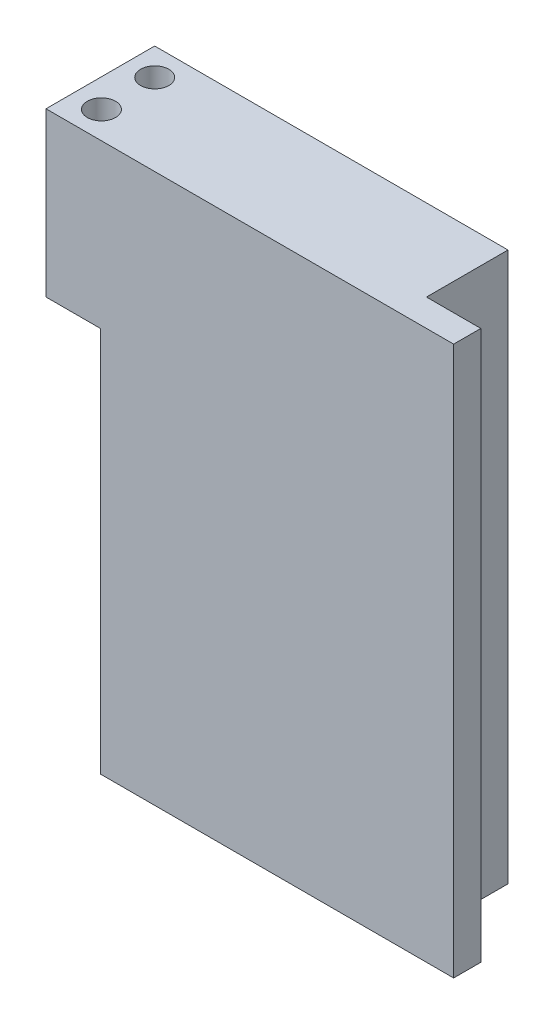
ISO-10303-21;
HEADER;
FILE_DESCRIPTION(('STEP AP214'),'2;1');
FILE_NAME('part.step','',(''),(''),'','','');
FILE_SCHEMA(('AUTOMOTIVE_DESIGN { 1 0 10303 214 1 1 1 1 }'));
ENDSEC;
DATA;
#1=APPLICATION_CONTEXT('core data for automotive mechanical design processes');
#2=APPLICATION_PROTOCOL_DEFINITION('international standard','automotive_design',2000,#1);
#3=PRODUCT_CONTEXT('',#1,'mechanical');
#4=PRODUCT('Part','Part','',(#3));
#5=PRODUCT_RELATED_PRODUCT_CATEGORY('part','',(#4));
#6=PRODUCT_DEFINITION_FORMATION('','',#4);
#7=PRODUCT_DEFINITION_CONTEXT('part definition',#1,'design');
#8=PRODUCT_DEFINITION('design','',#6,#7);
#9=PRODUCT_DEFINITION_SHAPE('','',#8);
#10=(LENGTH_UNIT() NAMED_UNIT(*) SI_UNIT(.MILLI.,.METRE.));
#11=(NAMED_UNIT(*) PLANE_ANGLE_UNIT() SI_UNIT($,.RADIAN.));
#12=(NAMED_UNIT(*) SI_UNIT($,.STERADIAN.) SOLID_ANGLE_UNIT());
#13=UNCERTAINTY_MEASURE_WITH_UNIT(LENGTH_MEASURE(1.E-05),#10,'distance_accuracy_value','');
#14=(GEOMETRIC_REPRESENTATION_CONTEXT(3) GLOBAL_UNCERTAINTY_ASSIGNED_CONTEXT((#13)) GLOBAL_UNIT_ASSIGNED_CONTEXT((#10,
#11,#12)) REPRESENTATION_CONTEXT('',''));
#15=CARTESIAN_POINT('',(0.,0.,0.));
#16=DIRECTION('',(0.,0.,1.));
#17=DIRECTION('',(1.,0.,0.));
#18=AXIS2_PLACEMENT_3D('',#15,#16,#17);
#19=CARTESIAN_POINT('',(0.,-1.27,0.));
#20=DIRECTION('',(-1.,0.,0.));
#21=DIRECTION('',(0.,0.,1.));
#22=AXIS2_PLACEMENT_3D('',#19,#20,#21);
#23=PLANE('',#22);
#24=DIRECTION('',(0.,1.,0.));
#25=VECTOR('',#24,1.);
#26=CARTESIAN_POINT('',(0.,-1.27,25.4));
#27=LINE('',#26,#25);
#28=CARTESIAN_POINT('',(0.,-1.27,25.4));
#29=VERTEX_POINT('',#28);
#30=CARTESIAN_POINT('',(0.,88.8999999999998,25.4));
#31=VERTEX_POINT('',#30);
#32=EDGE_CURVE('E11',#29,#31,#27,.T.);
#33=ORIENTED_EDGE('',*,*,#32,.T.);
#34=DIRECTION('',(0.,0.,-1.));
#35=VECTOR('',#34,1.);
#36=CARTESIAN_POINT('',(0.,88.8999999999998,25.4));
#37=LINE('',#36,#35);
#38=CARTESIAN_POINT('',(0.,88.8999999999998,0.));
#39=VERTEX_POINT('',#38);
#40=EDGE_CURVE('E158',#31,#39,#37,.T.);
#41=ORIENTED_EDGE('',*,*,#40,.T.);
#42=DIRECTION('',(0.,1.,0.));
#43=VECTOR('',#42,1.);
#44=CARTESIAN_POINT('',(0.,-1.27,0.));
#45=LINE('',#44,#43);
#46=CARTESIAN_POINT('',(0.,-1.27,0.));
#47=VERTEX_POINT('',#46);
#48=EDGE_CURVE('E42',#47,#39,#45,.T.);
#49=ORIENTED_EDGE('',*,*,#48,.F.);
#50=DIRECTION('',(0.,0.,1.));
#51=VECTOR('',#50,1.);
#52=CARTESIAN_POINT('',(0.,-1.27,0.));
#53=LINE('',#52,#51);
#54=EDGE_CURVE('E129',#47,#29,#53,.T.);
#55=ORIENTED_EDGE('',*,*,#54,.T.);
#56=EDGE_LOOP('',(#33,#41,#49,#55));
#57=FACE_BOUND('',#56,.T.);
#58=ADVANCED_FACE('F33',(#57),#23,.T.);
#59=CARTESIAN_POINT('',(0.,-1.27,25.4));
#60=DIRECTION('',(0.,0.,1.));
#61=DIRECTION('',(1.,0.,0.));
#62=AXIS2_PLACEMENT_3D('',#59,#60,#61);
#63=PLANE('',#62);
#64=DIRECTION('',(0.,1.,0.));
#65=VECTOR('',#64,1.);
#66=CARTESIAN_POINT('',(82.55,-1.27,25.4));
#67=LINE('',#66,#65);
#68=CARTESIAN_POINT('',(82.55,-1.27,25.4));
#69=VERTEX_POINT('',#68);
#70=CARTESIAN_POINT('',(82.55,127.,25.4));
#71=VERTEX_POINT('',#70);
#72=EDGE_CURVE('E124',#69,#71,#67,.T.);
#73=ORIENTED_EDGE('',*,*,#72,.T.);
#74=DIRECTION('',(1.,0.,0.));
#75=VECTOR('',#74,1.);
#76=CARTESIAN_POINT('',(0.,127.,25.4));
#77=LINE('',#76,#75);
#78=CARTESIAN_POINT('',(-12.7,127.,25.4));
#79=VERTEX_POINT('',#78);
#80=EDGE_CURVE('E168',#79,#71,#77,.T.);
#81=ORIENTED_EDGE('',*,*,#80,.F.);
#82=DIRECTION('',(0.,1.,0.));
#83=VECTOR('',#82,1.);
#84=CARTESIAN_POINT('',(-12.7,88.8999999999998,25.4));
#85=LINE('',#84,#83);
#86=CARTESIAN_POINT('',(-12.7,88.8999999999998,25.4));
#87=VERTEX_POINT('',#86);
#88=EDGE_CURVE('E165',#87,#79,#85,.T.);
#89=ORIENTED_EDGE('',*,*,#88,.F.);
#90=DIRECTION('',(1.,0.,0.));
#91=VECTOR('',#90,1.);
#92=CARTESIAN_POINT('',(-12.7,88.8999999999998,25.4));
#93=LINE('',#92,#91);
#94=EDGE_CURVE('E146',#87,#31,#93,.T.);
#95=ORIENTED_EDGE('',*,*,#94,.T.);
#96=ORIENTED_EDGE('',*,*,#32,.F.);
#97=DIRECTION('',(1.,0.,0.));
#98=VECTOR('',#97,1.);
#99=CARTESIAN_POINT('',(0.,-1.27,25.4));
#100=LINE('',#99,#98);
#101=EDGE_CURVE('E127',#29,#69,#100,.T.);
#102=ORIENTED_EDGE('',*,*,#101,.T.);
#103=EDGE_LOOP('',(#73,#81,#89,#95,#96,#102));
#104=FACE_BOUND('',#103,.T.);
#105=ADVANCED_FACE('F35',(#104),#63,.T.);
#106=CARTESIAN_POINT('',(0.,-1.27,0.));
#107=DIRECTION('',(0.,0.,1.));
#108=DIRECTION('',(1.,0.,0.));
#109=AXIS2_PLACEMENT_3D('',#106,#107,#108);
#110=PLANE('',#109);
#111=DIRECTION('',(1.,0.,0.));
#112=VECTOR('',#111,1.);
#113=CARTESIAN_POINT('',(0.,127.,0.));
#114=LINE('',#113,#112);
#115=CARTESIAN_POINT('',(-12.7,127.,0.));
#116=VERTEX_POINT('',#115);
#117=CARTESIAN_POINT('',(69.85,127.,0.));
#118=VERTEX_POINT('',#117);
#119=EDGE_CURVE('E131',#116,#118,#114,.T.);
#120=ORIENTED_EDGE('',*,*,#119,.T.);
#121=DIRECTION('',(0.,1.,0.));
#122=VECTOR('',#121,1.);
#123=CARTESIAN_POINT('',(69.85,-1.26999999999999,0.));
#124=LINE('',#123,#122);
#125=CARTESIAN_POINT('',(69.85,-1.26999999999999,0.));
#126=VERTEX_POINT('',#125);
#127=EDGE_CURVE('E50',#126,#118,#124,.T.);
#128=ORIENTED_EDGE('',*,*,#127,.F.);
#129=DIRECTION('',(1.,0.,0.));
#130=VECTOR('',#129,1.);
#131=CARTESIAN_POINT('',(0.,-1.27,0.));
#132=LINE('',#131,#130);
#133=EDGE_CURVE('E126',#47,#126,#132,.T.);
#134=ORIENTED_EDGE('',*,*,#133,.F.);
#135=ORIENTED_EDGE('',*,*,#48,.T.);
#136=DIRECTION('',(-1.,0.,0.));
#137=VECTOR('',#136,1.);
#138=CARTESIAN_POINT('',(0.,88.8999999999998,0.));
#139=LINE('',#138,#137);
#140=CARTESIAN_POINT('',(-12.7,88.8999999999998,0.));
#141=VERTEX_POINT('',#140);
#142=EDGE_CURVE('E58',#39,#141,#139,.T.);
#143=ORIENTED_EDGE('',*,*,#142,.T.);
#144=DIRECTION('',(0.,1.,0.));
#145=VECTOR('',#144,1.);
#146=CARTESIAN_POINT('',(-12.7,88.8999999999998,0.));
#147=LINE('',#146,#145);
#148=EDGE_CURVE('E163',#141,#116,#147,.T.);
#149=ORIENTED_EDGE('',*,*,#148,.T.);
#150=EDGE_LOOP('',(#120,#128,#134,#135,#143,#149));
#151=FACE_BOUND('',#150,.T.);
#152=ADVANCED_FACE('F176',(#151),#110,.F.);
#153=CARTESIAN_POINT('',(82.55,-1.27,0.));
#154=DIRECTION('',(-1.,0.,0.));
#155=DIRECTION('',(0.,0.,1.));
#156=AXIS2_PLACEMENT_3D('',#153,#154,#155);
#157=PLANE('',#156);
#158=DIRECTION('',(0.,0.,1.));
#159=VECTOR('',#158,1.);
#160=CARTESIAN_POINT('',(82.55,-1.27,0.));
#161=LINE('',#160,#159);
#162=CARTESIAN_POINT('',(82.55,-1.26999999999999,19.05));
#163=VERTEX_POINT('',#162);
#164=EDGE_CURVE('E117',#163,#69,#161,.T.);
#165=ORIENTED_EDGE('',*,*,#164,.F.);
#166=DIRECTION('',(0.,1.,0.));
#167=VECTOR('',#166,1.);
#168=CARTESIAN_POINT('',(82.55,-1.26999999999999,19.05));
#169=LINE('',#168,#167);
#170=CARTESIAN_POINT('',(82.55,127.,19.05));
#171=VERTEX_POINT('',#170);
#172=EDGE_CURVE('E102',#163,#171,#169,.T.);
#173=ORIENTED_EDGE('',*,*,#172,.T.);
#174=DIRECTION('',(0.,0.,1.));
#175=VECTOR('',#174,1.);
#176=CARTESIAN_POINT('',(82.55,127.,0.));
#177=LINE('',#176,#175);
#178=EDGE_CURVE('E173',#171,#71,#177,.T.);
#179=ORIENTED_EDGE('',*,*,#178,.T.);
#180=ORIENTED_EDGE('',*,*,#72,.F.);
#181=EDGE_LOOP('',(#165,#173,#179,#180));
#182=FACE_BOUND('',#181,.T.);
#183=ADVANCED_FACE('F122',(#182),#157,.F.);
#184=CARTESIAN_POINT('',(0.,-1.27,0.));
#185=DIRECTION('',(0.,-1.,0.));
#186=DIRECTION('',(0.,0.,-1.));
#187=AXIS2_PLACEMENT_3D('',#184,#185,#186);
#188=PLANE('',#187);
#189=DIRECTION('',(1.,0.,0.));
#190=VECTOR('',#189,1.);
#191=CARTESIAN_POINT('',(82.55,-1.26999999999999,19.05));
#192=LINE('',#191,#190);
#193=CARTESIAN_POINT('',(69.85,-1.26999999999999,19.05));
#194=VERTEX_POINT('',#193);
#195=EDGE_CURVE('E105',#194,#163,#192,.T.);
#196=ORIENTED_EDGE('',*,*,#195,.T.);
#197=ORIENTED_EDGE('',*,*,#164,.T.);
#198=ORIENTED_EDGE('',*,*,#101,.F.);
#199=ORIENTED_EDGE('',*,*,#54,.F.);
#200=ORIENTED_EDGE('',*,*,#133,.T.);
#201=DIRECTION('',(0.,0.,1.));
#202=VECTOR('',#201,1.);
#203=CARTESIAN_POINT('',(69.85,-1.26999999999999,19.05));
#204=LINE('',#203,#202);
#205=EDGE_CURVE('E112',#126,#194,#204,.T.);
#206=ORIENTED_EDGE('',*,*,#205,.T.);
#207=EDGE_LOOP('',(#196,#197,#198,#199,#200,#206));
#208=FACE_BOUND('',#207,.T.);
#209=ADVANCED_FACE('F115',(#208),#188,.T.);
#210=CARTESIAN_POINT('',(0.,127.,0.));
#211=DIRECTION('',(0.,-1.,0.));
#212=DIRECTION('',(0.,0.,-1.));
#213=AXIS2_PLACEMENT_3D('',#210,#211,#212);
#214=PLANE('',#213);
#215=CARTESIAN_POINT('',(-6.35,127.,6.35));
#216=DIRECTION('',(0.,1.,0.));
#217=DIRECTION('',(0.,0.,1.));
#218=AXIS2_PLACEMENT_3D('',#215,#216,#217);
#219=CIRCLE('',#218,3.302);
#220=CARTESIAN_POINT('',(-6.35,127.,9.652));
#221=VERTEX_POINT('',#220);
#222=EDGE_CURVE('E153',#221,#221,#219,.T.);
#223=ORIENTED_EDGE('',*,*,#222,.F.);
#224=EDGE_LOOP('',(#223));
#225=FACE_BOUND('',#224,.T.);
#226=CARTESIAN_POINT('',(-6.096,127.,19.05));
#227=DIRECTION('',(0.,1.,0.));
#228=DIRECTION('',(0.,0.,1.));
#229=AXIS2_PLACEMENT_3D('',#226,#227,#228);
#230=CIRCLE('',#229,3.302);
#231=CARTESIAN_POINT('',(-6.096,127.,22.352));
#232=VERTEX_POINT('',#231);
#233=EDGE_CURVE('E142',#232,#232,#230,.T.);
#234=ORIENTED_EDGE('',*,*,#233,.F.);
#235=EDGE_LOOP('',(#234));
#236=FACE_BOUND('',#235,.T.);
#237=ORIENTED_EDGE('',*,*,#178,.F.);
#238=DIRECTION('',(1.,0.,0.));
#239=VECTOR('',#238,1.);
#240=CARTESIAN_POINT('',(82.55,127.,19.05));
#241=LINE('',#240,#239);
#242=CARTESIAN_POINT('',(69.85,127.,19.05));
#243=VERTEX_POINT('',#242);
#244=EDGE_CURVE('E108',#243,#171,#241,.T.);
#245=ORIENTED_EDGE('',*,*,#244,.F.);
#246=DIRECTION('',(0.,0.,1.));
#247=VECTOR('',#246,1.);
#248=CARTESIAN_POINT('',(69.85,127.,19.05));
#249=LINE('',#248,#247);
#250=EDGE_CURVE('E120',#118,#243,#249,.T.);
#251=ORIENTED_EDGE('',*,*,#250,.F.);
#252=ORIENTED_EDGE('',*,*,#119,.F.);
#253=DIRECTION('',(0.,0.,1.));
#254=VECTOR('',#253,1.);
#255=CARTESIAN_POINT('',(-12.7,127.,0.));
#256=LINE('',#255,#254);
#257=EDGE_CURVE('E141',#116,#79,#256,.T.);
#258=ORIENTED_EDGE('',*,*,#257,.T.);
#259=ORIENTED_EDGE('',*,*,#80,.T.);
#260=EDGE_LOOP('',(#237,#245,#251,#252,#258,#259));
#261=FACE_BOUND('',#260,.T.);
#262=ADVANCED_FACE('F180',(#225,#236,#261),#214,.F.);
#263=CARTESIAN_POINT('',(-12.7,88.8999999999998,0.));
#264=DIRECTION('',(-1.,0.,0.));
#265=DIRECTION('',(0.,0.,1.));
#266=AXIS2_PLACEMENT_3D('',#263,#264,#265);
#267=PLANE('',#266);
#268=ORIENTED_EDGE('',*,*,#257,.F.);
#269=ORIENTED_EDGE('',*,*,#148,.F.);
#270=DIRECTION('',(0.,0.,1.));
#271=VECTOR('',#270,1.);
#272=CARTESIAN_POINT('',(-12.7,88.8999999999998,0.));
#273=LINE('',#272,#271);
#274=EDGE_CURVE('E161',#141,#87,#273,.T.);
#275=ORIENTED_EDGE('',*,*,#274,.T.);
#276=ORIENTED_EDGE('',*,*,#88,.T.);
#277=EDGE_LOOP('',(#268,#269,#275,#276));
#278=FACE_BOUND('',#277,.T.);
#279=ADVANCED_FACE('F195',(#278),#267,.T.);
#280=CARTESIAN_POINT('',(0.,88.8999999999998,0.));
#281=DIRECTION('',(0.,1.,0.));
#282=DIRECTION('',(0.,0.,1.));
#283=AXIS2_PLACEMENT_3D('',#280,#281,#282);
#284=PLANE('',#283);
#285=CARTESIAN_POINT('',(-6.35,88.8999999999998,6.35));
#286=DIRECTION('',(0.,1.,0.));
#287=DIRECTION('',(0.,0.,1.));
#288=AXIS2_PLACEMENT_3D('',#285,#286,#287);
#289=CIRCLE('',#288,3.302);
#290=CARTESIAN_POINT('',(-6.35,88.8999999999998,9.652));
#291=VERTEX_POINT('',#290);
#292=EDGE_CURVE('E37',#291,#291,#289,.T.);
#293=ORIENTED_EDGE('',*,*,#292,.T.);
#294=EDGE_LOOP('',(#293));
#295=FACE_BOUND('',#294,.T.);
#296=CARTESIAN_POINT('',(-6.096,88.8999999999998,19.05));
#297=DIRECTION('',(0.,1.,0.));
#298=DIRECTION('',(0.,0.,1.));
#299=AXIS2_PLACEMENT_3D('',#296,#297,#298);
#300=CIRCLE('',#299,3.302);
#301=CARTESIAN_POINT('',(-6.096,88.8999999999998,22.352));
#302=VERTEX_POINT('',#301);
#303=EDGE_CURVE('E139',#302,#302,#300,.T.);
#304=ORIENTED_EDGE('',*,*,#303,.T.);
#305=EDGE_LOOP('',(#304));
#306=FACE_BOUND('',#305,.T.);
#307=ORIENTED_EDGE('',*,*,#94,.F.);
#308=ORIENTED_EDGE('',*,*,#274,.F.);
#309=ORIENTED_EDGE('',*,*,#142,.F.);
#310=ORIENTED_EDGE('',*,*,#40,.F.);
#311=EDGE_LOOP('',(#307,#308,#309,#310));
#312=FACE_BOUND('',#311,.T.);
#313=ADVANCED_FACE('F201',(#295,#306,#312),#284,.F.);
#314=CARTESIAN_POINT('',(-6.096,73.6599999999998,19.05));
#315=DIRECTION('',(0.,1.,0.));
#316=DIRECTION('',(0.,0.,1.));
#317=AXIS2_PLACEMENT_3D('',#314,#315,#316);
#318=CYLINDRICAL_SURFACE('',#317,3.302);
#319=ORIENTED_EDGE('',*,*,#233,.T.);
#320=EDGE_LOOP('',(#319));
#321=FACE_BOUND('',#320,.T.);
#322=ORIENTED_EDGE('',*,*,#303,.F.);
#323=EDGE_LOOP('',(#322));
#324=FACE_BOUND('',#323,.T.);
#325=ADVANCED_FACE('F255',(#321,#324),#318,.F.);
#326=CARTESIAN_POINT('',(-6.35,54.1019999999999,6.35));
#327=DIRECTION('',(0.,1.,0.));
#328=DIRECTION('',(0.,0.,1.));
#329=AXIS2_PLACEMENT_3D('',#326,#327,#328);
#330=CYLINDRICAL_SURFACE('',#329,3.302);
#331=CARTESIAN_POINT('',(-6.35,127.,9.652));
#332=CARTESIAN_POINT('',(-6.35,126.603125,9.652));
#333=CARTESIAN_POINT('',(-6.35,126.20625,9.652));
#334=CARTESIAN_POINT('',(-6.35,125.4125,9.652));
#335=CARTESIAN_POINT('',(-6.35,125.015625,9.652));
#336=CARTESIAN_POINT('',(-6.35,124.221875,9.652));
#337=CARTESIAN_POINT('',(-6.35,123.825,9.652));
#338=CARTESIAN_POINT('',(-6.35,123.03125,9.652));
#339=CARTESIAN_POINT('',(-6.35,122.634375,9.652));
#340=CARTESIAN_POINT('',(-6.35,121.840625,9.652));
#341=CARTESIAN_POINT('',(-6.35,121.44375,9.652));
#342=CARTESIAN_POINT('',(-6.35,120.65,9.652));
#343=CARTESIAN_POINT('',(-6.35,120.253125,9.652));
#344=CARTESIAN_POINT('',(-6.35,119.459375,9.652));
#345=CARTESIAN_POINT('',(-6.35,119.0625,9.652));
#346=CARTESIAN_POINT('',(-6.35,118.26875,9.652));
#347=CARTESIAN_POINT('',(-6.35,117.871875,9.652));
#348=CARTESIAN_POINT('',(-6.35,117.078125,9.652));
#349=CARTESIAN_POINT('',(-6.35,116.68125,9.652));
#350=CARTESIAN_POINT('',(-6.35,115.8875,9.652));
#351=CARTESIAN_POINT('',(-6.35,115.490625,9.652));
#352=CARTESIAN_POINT('',(-6.35,114.696875,9.652));
#353=CARTESIAN_POINT('',(-6.35,114.3,9.652));
#354=CARTESIAN_POINT('',(-6.35,113.50625,9.652));
#355=CARTESIAN_POINT('',(-6.35,113.109375,9.652));
#356=CARTESIAN_POINT('',(-6.35,112.315625,9.652));
#357=CARTESIAN_POINT('',(-6.35,111.91875,9.652));
#358=CARTESIAN_POINT('',(-6.35,111.125,9.652));
#359=CARTESIAN_POINT('',(-6.35,110.728125,9.652));
#360=CARTESIAN_POINT('',(-6.35,109.934375,9.652));
#361=CARTESIAN_POINT('',(-6.35,109.5375,9.652));
#362=CARTESIAN_POINT('',(-6.35,108.74375,9.652));
#363=CARTESIAN_POINT('',(-6.35,108.346875,9.652));
#364=CARTESIAN_POINT('',(-6.35,107.553125,9.652));
#365=CARTESIAN_POINT('',(-6.35,107.15625,9.652));
#366=CARTESIAN_POINT('',(-6.35,106.3625,9.652));
#367=CARTESIAN_POINT('',(-6.35,105.965625,9.652));
#368=CARTESIAN_POINT('',(-6.35,105.171875,9.652));
#369=CARTESIAN_POINT('',(-6.35,104.775,9.652));
#370=CARTESIAN_POINT('',(-6.35,103.98125,9.652));
#371=CARTESIAN_POINT('',(-6.35,103.584375,9.652));
#372=CARTESIAN_POINT('',(-6.35,102.790625,9.652));
#373=CARTESIAN_POINT('',(-6.35,102.39375,9.652));
#374=CARTESIAN_POINT('',(-6.35,101.6,9.652));
#375=CARTESIAN_POINT('',(-6.35,101.203125,9.652));
#376=CARTESIAN_POINT('',(-6.35,100.409375,9.652));
#377=CARTESIAN_POINT('',(-6.35,100.0125,9.652));
#378=CARTESIAN_POINT('',(-6.35,99.2187499999999,9.652));
#379=CARTESIAN_POINT('',(-6.35,98.8218749999999,9.652));
#380=CARTESIAN_POINT('',(-6.35,98.0281249999999,9.652));
#381=CARTESIAN_POINT('',(-6.35,97.6312499999999,9.652));
#382=CARTESIAN_POINT('',(-6.35,96.8374999999999,9.652));
#383=CARTESIAN_POINT('',(-6.35,96.4406249999999,9.652));
#384=CARTESIAN_POINT('',(-6.35,95.6468749999999,9.652));
#385=CARTESIAN_POINT('',(-6.35,95.2499999999998,9.652));
#386=CARTESIAN_POINT('',(-6.35,94.4562499999998,9.652));
#387=CARTESIAN_POINT('',(-6.35,94.0593749999998,9.652));
#388=CARTESIAN_POINT('',(-6.35,93.2656249999998,9.652));
#389=CARTESIAN_POINT('',(-6.35,92.8687499999998,9.652));
#390=CARTESIAN_POINT('',(-6.35,92.0749999999998,9.652));
#391=CARTESIAN_POINT('',(-6.35,91.6781249999999,9.652));
#392=CARTESIAN_POINT('',(-6.35,90.8843749999998,9.652));
#393=CARTESIAN_POINT('',(-6.35,90.4874999999998,9.652));
#394=CARTESIAN_POINT('',(-6.35,89.6937499999998,9.652));
#395=CARTESIAN_POINT('',(-6.35,89.2968749999998,9.652));
#396=CARTESIAN_POINT('',(-6.35,88.8999999999998,9.652));
#397=B_SPLINE_CURVE_WITH_KNOTS('',3,(#331,#332,#333,#334,#335,#336,#337,#338,#339,#340,#341,
#342,#343,#344,#345,#346,#347,#348,#349,#350,#351,#352,#353,#354,#355,#356,#357,#358,#359,#360,
#361,#362,#363,#364,#365,#366,#367,#368,#369,#370,#371,#372,#373,#374,#375,#376,#377,#378,#379,
#380,#381,#382,#383,#384,#385,#386,#387,#388,#389,#390,#391,#392,#393,#394,#395,#396),
.UNSPECIFIED.,.F.,.F.,(4,2,2,2,2,2,2,2,2,2,2,2,2,2,2,2,2,2,2,2,2,2,2,2,2,2,2,2,2,2,2,2,4),(0.,
1.190625,2.38125,3.571875,4.76250000000002,5.95312500000002,7.14375000000002,8.33437500000003,
9.52500000000003,10.715625,11.90625,13.096875,14.2875000000001,15.4781250000001,
16.6687500000001,17.8593750000001,19.0500000000001,20.2406250000001,21.4312500000001,
22.6218750000001,23.8125000000001,25.0031250000001,26.1937500000001,27.3843750000001,
28.5750000000001,29.7656250000001,30.9562500000001,32.1468750000002,33.3375000000002,
34.5281250000002,35.7187500000002,36.9093750000002,38.1000000000002),.UNSPECIFIED.);
#398=EDGE_CURVE('BSEAM190',#221,#291,#397,.T.);
#399=ORIENTED_EDGE('',*,*,#222,.T.);
#400=ORIENTED_EDGE('',*,*,#292,.F.);
#401=ORIENTED_EDGE('',*,*,#398,.T.);
#402=ORIENTED_EDGE('',*,*,#398,.F.);
#403=EDGE_LOOP('',(#399,#401,#400,#402));
#404=FACE_BOUND('',#403,.T.);
#405=ADVANCED_FACE('F190',(#404),#330,.F.);
#406=CARTESIAN_POINT('',(82.55,-1.26999999999999,19.05));
#407=DIRECTION('',(0.,0.,1.));
#408=DIRECTION('',(1.,0.,0.));
#409=AXIS2_PLACEMENT_3D('',#406,#407,#408);
#410=PLANE('',#409);
#411=ORIENTED_EDGE('',*,*,#244,.T.);
#412=ORIENTED_EDGE('',*,*,#172,.F.);
#413=ORIENTED_EDGE('',*,*,#195,.F.);
#414=DIRECTION('',(0.,1.,0.));
#415=VECTOR('',#414,1.);
#416=CARTESIAN_POINT('',(69.85,-1.26999999999999,19.05));
#417=LINE('',#416,#415);
#418=EDGE_CURVE('E185',#194,#243,#417,.T.);
#419=ORIENTED_EDGE('',*,*,#418,.T.);
#420=EDGE_LOOP('',(#411,#412,#413,#419));
#421=FACE_BOUND('',#420,.T.);
#422=ADVANCED_FACE('F104',(#421),#410,.F.);
#423=CARTESIAN_POINT('',(69.85,-1.26999999999999,19.05));
#424=DIRECTION('',(-1.,0.,0.));
#425=DIRECTION('',(0.,0.,1.));
#426=AXIS2_PLACEMENT_3D('',#423,#424,#425);
#427=PLANE('',#426);
#428=ORIENTED_EDGE('',*,*,#250,.T.);
#429=ORIENTED_EDGE('',*,*,#418,.F.);
#430=ORIENTED_EDGE('',*,*,#205,.F.);
#431=ORIENTED_EDGE('',*,*,#127,.T.);
#432=EDGE_LOOP('',(#428,#429,#430,#431));
#433=FACE_BOUND('',#432,.T.);
#434=ADVANCED_FACE('F239',(#433),#427,.F.);
#435=CLOSED_SHELL('',(#58,#105,#152,#183,#209,#262,#279,#313,#325,#405,#422,#434));
#436=MANIFOLD_SOLID_BREP('B2',#435);
#437=ADVANCED_BREP_SHAPE_REPRESENTATION('',(#18,#436),#14);
#438=SHAPE_DEFINITION_REPRESENTATION(#9,#437);
ENDSEC;
END-ISO-10303-21;
